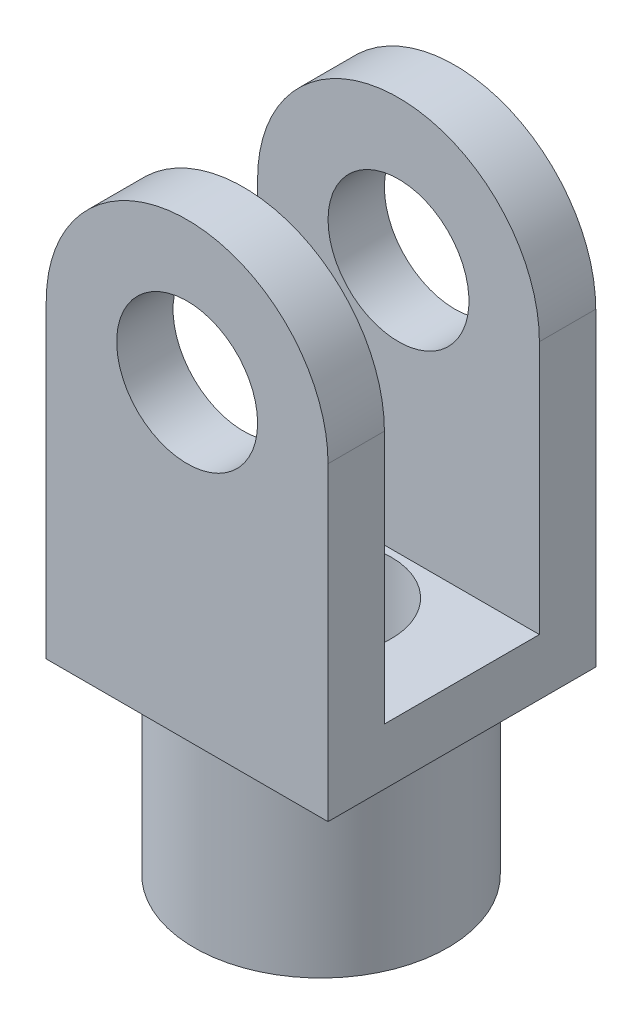
ISO-10303-21;
HEADER;
FILE_DESCRIPTION(('STEP AP214'),'2;1');
FILE_NAME('part.step','',(''),(''),'','','');
FILE_SCHEMA(('AUTOMOTIVE_DESIGN { 1 0 10303 214 1 1 1 1 }'));
ENDSEC;
DATA;
#1=APPLICATION_CONTEXT('core data for automotive mechanical design processes');
#2=APPLICATION_PROTOCOL_DEFINITION('international standard','automotive_design',2000,#1);
#3=PRODUCT_CONTEXT('',#1,'mechanical');
#4=PRODUCT('Part','Part','',(#3));
#5=PRODUCT_RELATED_PRODUCT_CATEGORY('part','',(#4));
#6=PRODUCT_DEFINITION_FORMATION('','',#4);
#7=PRODUCT_DEFINITION_CONTEXT('part definition',#1,'design');
#8=PRODUCT_DEFINITION('design','',#6,#7);
#9=PRODUCT_DEFINITION_SHAPE('','',#8);
#10=(LENGTH_UNIT() NAMED_UNIT(*) SI_UNIT(.MILLI.,.METRE.));
#11=(NAMED_UNIT(*) PLANE_ANGLE_UNIT() SI_UNIT($,.RADIAN.));
#12=(NAMED_UNIT(*) SI_UNIT($,.STERADIAN.) SOLID_ANGLE_UNIT());
#13=UNCERTAINTY_MEASURE_WITH_UNIT(LENGTH_MEASURE(1.E-05),#10,'distance_accuracy_value','');
#14=(GEOMETRIC_REPRESENTATION_CONTEXT(3) GLOBAL_UNCERTAINTY_ASSIGNED_CONTEXT((#13)) GLOBAL_UNIT_ASSIGNED_CONTEXT((#10,
#11,#12)) REPRESENTATION_CONTEXT('',''));
#15=CARTESIAN_POINT('',(0.,0.,0.));
#16=DIRECTION('',(0.,0.,1.));
#17=DIRECTION('',(1.,0.,0.));
#18=AXIS2_PLACEMENT_3D('',#15,#16,#17);
#19=CARTESIAN_POINT('',(10.,22.,19.));
#20=DIRECTION('',(0.,0.,-1.));
#21=DIRECTION('',(-1.,0.,0.));
#22=AXIS2_PLACEMENT_3D('',#19,#20,#21);
#23=CYLINDRICAL_SURFACE('',#22,10.);
#24=DIRECTION('',(0.,0.,-1.));
#25=VECTOR('',#24,1.);
#26=CARTESIAN_POINT('',(0.,22.,19.));
#27=LINE('',#26,#25);
#28=CARTESIAN_POINT('',(0.,22.,4.));
#29=VERTEX_POINT('',#28);
#30=CARTESIAN_POINT('',(0.,22.,0.));
#31=VERTEX_POINT('',#30);
#32=EDGE_CURVE('E176',#29,#31,#27,.T.);
#33=ORIENTED_EDGE('',*,*,#32,.F.);
#34=CARTESIAN_POINT('',(10.,22.,4.));
#35=DIRECTION('',(0.,0.,-1.));
#36=DIRECTION('',(-1.,0.,0.));
#37=AXIS2_PLACEMENT_3D('',#34,#35,#36);
#38=CIRCLE('',#37,10.);
#39=CARTESIAN_POINT('',(20.,22.,4.));
#40=VERTEX_POINT('',#39);
#41=EDGE_CURVE('E144',#29,#40,#38,.T.);
#42=ORIENTED_EDGE('',*,*,#41,.T.);
#43=DIRECTION('',(0.,0.,-1.));
#44=VECTOR('',#43,1.);
#45=CARTESIAN_POINT('',(20.,22.,19.));
#46=LINE('',#45,#44);
#47=CARTESIAN_POINT('',(20.,22.,0.));
#48=VERTEX_POINT('',#47);
#49=EDGE_CURVE('E136',#40,#48,#46,.T.);
#50=ORIENTED_EDGE('',*,*,#49,.T.);
#51=CARTESIAN_POINT('',(10.,22.,0.));
#52=DIRECTION('',(0.,0.,1.));
#53=DIRECTION('',(1.,0.,0.));
#54=AXIS2_PLACEMENT_3D('',#51,#52,#53);
#55=CIRCLE('',#54,10.);
#56=EDGE_CURVE('E164',#48,#31,#55,.T.);
#57=ORIENTED_EDGE('',*,*,#56,.T.);
#58=EDGE_LOOP('',(#33,#42,#50,#57));
#59=FACE_BOUND('',#58,.T.);
#60=ADVANCED_FACE('F41',(#59),#23,.T.);
#61=CARTESIAN_POINT('',(10.,22.,19.));
#62=DIRECTION('',(0.,0.,-1.));
#63=DIRECTION('',(-1.,0.,0.));
#64=AXIS2_PLACEMENT_3D('',#61,#62,#63);
#65=CYLINDRICAL_SURFACE('',#64,5.);
#66=CARTESIAN_POINT('',(10.,22.,15.));
#67=DIRECTION('',(0.,0.,1.));
#68=DIRECTION('',(1.,0.,0.));
#69=AXIS2_PLACEMENT_3D('',#66,#67,#68);
#70=CIRCLE('',#69,5.);
#71=CARTESIAN_POINT('',(15.,22.,15.));
#72=VERTEX_POINT('',#71);
#73=EDGE_CURVE('E146',#72,#72,#70,.T.);
#74=ORIENTED_EDGE('',*,*,#73,.F.);
#75=EDGE_LOOP('',(#74));
#76=FACE_BOUND('',#75,.T.);
#77=CARTESIAN_POINT('',(10.,22.,19.));
#78=DIRECTION('',(0.,0.,1.));
#79=DIRECTION('',(1.,0.,0.));
#80=AXIS2_PLACEMENT_3D('',#77,#78,#79);
#81=CIRCLE('',#80,5.);
#82=CARTESIAN_POINT('',(15.,22.,19.));
#83=VERTEX_POINT('',#82);
#84=EDGE_CURVE('E159',#83,#83,#81,.T.);
#85=ORIENTED_EDGE('',*,*,#84,.T.);
#86=EDGE_LOOP('',(#85));
#87=FACE_BOUND('',#86,.T.);
#88=ADVANCED_FACE('F188',(#76,#87),#65,.F.);
#89=CARTESIAN_POINT('',(20.,0.,19.));
#90=DIRECTION('',(-1.,0.,0.));
#91=DIRECTION('',(0.,0.,1.));
#92=AXIS2_PLACEMENT_3D('',#89,#90,#91);
#93=PLANE('',#92);
#94=DIRECTION('',(0.,0.,1.));
#95=VECTOR('',#94,1.);
#96=CARTESIAN_POINT('',(20.,4.,15.));
#97=LINE('',#96,#95);
#98=CARTESIAN_POINT('',(20.,4.,4.));
#99=VERTEX_POINT('',#98);
#100=CARTESIAN_POINT('',(20.,4.,15.));
#101=VERTEX_POINT('',#100);
#102=EDGE_CURVE('E117',#99,#101,#97,.T.);
#103=ORIENTED_EDGE('',*,*,#102,.T.);
#104=DIRECTION('',(0.,-1.,0.));
#105=VECTOR('',#104,1.);
#106=CARTESIAN_POINT('',(20.,32.,15.));
#107=LINE('',#106,#105);
#108=CARTESIAN_POINT('',(20.,22.,15.));
#109=VERTEX_POINT('',#108);
#110=EDGE_CURVE('E137',#109,#101,#107,.T.);
#111=ORIENTED_EDGE('',*,*,#110,.F.);
#112=CARTESIAN_POINT('',(20.,22.,19.));
#113=VERTEX_POINT('',#112);
#114=EDGE_CURVE('E50',#113,#109,#46,.T.);
#115=ORIENTED_EDGE('',*,*,#114,.F.);
#116=DIRECTION('',(0.,1.,0.));
#117=VECTOR('',#116,1.);
#118=CARTESIAN_POINT('',(20.,0.,19.));
#119=LINE('',#118,#117);
#120=CARTESIAN_POINT('',(20.,0.,19.));
#121=VERTEX_POINT('',#120);
#122=EDGE_CURVE('E151',#121,#113,#119,.T.);
#123=ORIENTED_EDGE('',*,*,#122,.F.);
#124=DIRECTION('',(0.,0.,-1.));
#125=VECTOR('',#124,1.);
#126=CARTESIAN_POINT('',(20.,0.,19.));
#127=LINE('',#126,#125);
#128=CARTESIAN_POINT('',(20.,0.,0.));
#129=VERTEX_POINT('',#128);
#130=EDGE_CURVE('E162',#121,#129,#127,.T.);
#131=ORIENTED_EDGE('',*,*,#130,.T.);
#132=DIRECTION('',(0.,1.,0.));
#133=VECTOR('',#132,1.);
#134=CARTESIAN_POINT('',(20.,0.,0.));
#135=LINE('',#134,#133);
#136=EDGE_CURVE('E150',#129,#48,#135,.T.);
#137=ORIENTED_EDGE('',*,*,#136,.T.);
#138=ORIENTED_EDGE('',*,*,#49,.F.);
#139=DIRECTION('',(0.,-1.,0.));
#140=VECTOR('',#139,1.);
#141=CARTESIAN_POINT('',(20.,32.,4.));
#142=LINE('',#141,#140);
#143=EDGE_CURVE('E128',#40,#99,#142,.T.);
#144=ORIENTED_EDGE('',*,*,#143,.T.);
#145=EDGE_LOOP('',(#103,#111,#115,#123,#131,#137,#138,#144));
#146=FACE_BOUND('',#145,.T.);
#147=ADVANCED_FACE('F43',(#146),#93,.F.);
#148=ORIENTED_EDGE('',*,*,#114,.T.);
#149=CARTESIAN_POINT('',(10.,22.,15.));
#150=DIRECTION('',(0.,0.,1.));
#151=DIRECTION('',(1.,0.,0.));
#152=AXIS2_PLACEMENT_3D('',#149,#150,#151);
#153=CIRCLE('',#152,10.);
#154=CARTESIAN_POINT('',(0.,22.,15.));
#155=VERTEX_POINT('',#154);
#156=EDGE_CURVE('E148',#109,#155,#153,.T.);
#157=ORIENTED_EDGE('',*,*,#156,.T.);
#158=CARTESIAN_POINT('',(0.,22.,19.));
#159=VERTEX_POINT('',#158);
#160=EDGE_CURVE('E177',#159,#155,#27,.T.);
#161=ORIENTED_EDGE('',*,*,#160,.F.);
#162=CARTESIAN_POINT('',(10.,22.,19.));
#163=DIRECTION('',(0.,0.,1.));
#164=DIRECTION('',(1.,0.,0.));
#165=AXIS2_PLACEMENT_3D('',#162,#163,#164);
#166=CIRCLE('',#165,10.);
#167=EDGE_CURVE('E96',#113,#159,#166,.T.);
#168=ORIENTED_EDGE('',*,*,#167,.F.);
#169=EDGE_LOOP('',(#148,#157,#161,#168));
#170=FACE_BOUND('',#169,.T.);
#171=ADVANCED_FACE('F210',(#170),#23,.T.);
#172=CARTESIAN_POINT('',(0.,0.,19.));
#173=DIRECTION('',(-1.,0.,0.));
#174=DIRECTION('',(0.,0.,1.));
#175=AXIS2_PLACEMENT_3D('',#172,#173,#174);
#176=PLANE('',#175);
#177=DIRECTION('',(0.,-1.,0.));
#178=VECTOR('',#177,1.);
#179=CARTESIAN_POINT('',(0.,32.,15.));
#180=LINE('',#179,#178);
#181=CARTESIAN_POINT('',(0.,4.,15.));
#182=VERTEX_POINT('',#181);
#183=EDGE_CURVE('E139',#155,#182,#180,.T.);
#184=ORIENTED_EDGE('',*,*,#183,.T.);
#185=DIRECTION('',(0.,0.,-1.));
#186=VECTOR('',#185,1.);
#187=CARTESIAN_POINT('',(0.,4.,15.));
#188=LINE('',#187,#186);
#189=CARTESIAN_POINT('',(0.,4.,4.));
#190=VERTEX_POINT('',#189);
#191=EDGE_CURVE('E133',#182,#190,#188,.T.);
#192=ORIENTED_EDGE('',*,*,#191,.T.);
#193=DIRECTION('',(0.,-1.,0.));
#194=VECTOR('',#193,1.);
#195=CARTESIAN_POINT('',(0.,32.,4.));
#196=LINE('',#195,#194);
#197=EDGE_CURVE('E131',#29,#190,#196,.T.);
#198=ORIENTED_EDGE('',*,*,#197,.F.);
#199=ORIENTED_EDGE('',*,*,#32,.T.);
#200=DIRECTION('',(0.,1.,0.));
#201=VECTOR('',#200,1.);
#202=CARTESIAN_POINT('',(0.,0.,0.));
#203=LINE('',#202,#201);
#204=CARTESIAN_POINT('',(0.,0.,0.));
#205=VERTEX_POINT('',#204);
#206=EDGE_CURVE('E167',#205,#31,#203,.T.);
#207=ORIENTED_EDGE('',*,*,#206,.F.);
#208=DIRECTION('',(0.,0.,-1.));
#209=VECTOR('',#208,1.);
#210=CARTESIAN_POINT('',(0.,0.,19.));
#211=LINE('',#210,#209);
#212=CARTESIAN_POINT('',(0.,0.,19.));
#213=VERTEX_POINT('',#212);
#214=EDGE_CURVE('E174',#213,#205,#211,.T.);
#215=ORIENTED_EDGE('',*,*,#214,.F.);
#216=DIRECTION('',(0.,1.,0.));
#217=VECTOR('',#216,1.);
#218=CARTESIAN_POINT('',(0.,0.,19.));
#219=LINE('',#218,#217);
#220=EDGE_CURVE('E155',#213,#159,#219,.T.);
#221=ORIENTED_EDGE('',*,*,#220,.T.);
#222=ORIENTED_EDGE('',*,*,#160,.T.);
#223=EDGE_LOOP('',(#184,#192,#198,#199,#207,#215,#221,#222));
#224=FACE_BOUND('',#223,.T.);
#225=ADVANCED_FACE('F216',(#224),#176,.T.);
#226=CARTESIAN_POINT('',(0.,0.,19.));
#227=DIRECTION('',(0.,1.,0.));
#228=DIRECTION('',(0.,0.,1.));
#229=AXIS2_PLACEMENT_3D('',#226,#227,#228);
#230=PLANE('',#229);
#231=CARTESIAN_POINT('',(10.,0.,9.5));
#232=DIRECTION('',(0.,-1.,0.));
#233=DIRECTION('',(0.,0.,-1.));
#234=AXIS2_PLACEMENT_3D('',#231,#232,#233);
#235=CIRCLE('',#234,9.);
#236=CARTESIAN_POINT('',(10.,0.,0.499999999999997));
#237=VERTEX_POINT('',#236);
#238=EDGE_CURVE('E11',#237,#237,#235,.T.);
#239=ORIENTED_EDGE('',*,*,#238,.F.);
#240=EDGE_LOOP('',(#239));
#241=FACE_BOUND('',#240,.T.);
#242=DIRECTION('',(1.,0.,0.));
#243=VECTOR('',#242,1.);
#244=CARTESIAN_POINT('',(0.,0.,0.));
#245=LINE('',#244,#243);
#246=EDGE_CURVE('E88',#205,#129,#245,.T.);
#247=ORIENTED_EDGE('',*,*,#246,.T.);
#248=ORIENTED_EDGE('',*,*,#130,.F.);
#249=DIRECTION('',(1.,0.,0.));
#250=VECTOR('',#249,1.);
#251=CARTESIAN_POINT('',(0.,0.,19.));
#252=LINE('',#251,#250);
#253=EDGE_CURVE('E67',#213,#121,#252,.T.);
#254=ORIENTED_EDGE('',*,*,#253,.F.);
#255=ORIENTED_EDGE('',*,*,#214,.T.);
#256=EDGE_LOOP('',(#247,#248,#254,#255));
#257=FACE_BOUND('',#256,.T.);
#258=ADVANCED_FACE('F205',(#241,#257),#230,.F.);
#259=CARTESIAN_POINT('',(10.,22.,4.));
#260=DIRECTION('',(0.,0.,-1.));
#261=DIRECTION('',(-1.,0.,0.));
#262=AXIS2_PLACEMENT_3D('',#259,#260,#261);
#263=CIRCLE('',#262,5.);
#264=CARTESIAN_POINT('',(5.,22.,4.));
#265=VERTEX_POINT('',#264);
#266=EDGE_CURVE('E147',#265,#265,#263,.T.);
#267=ORIENTED_EDGE('',*,*,#266,.F.);
#268=EDGE_LOOP('',(#267));
#269=FACE_BOUND('',#268,.T.);
#270=CARTESIAN_POINT('',(10.,22.,0.));
#271=DIRECTION('',(0.,0.,1.));
#272=DIRECTION('',(1.,0.,0.));
#273=AXIS2_PLACEMENT_3D('',#270,#271,#272);
#274=CIRCLE('',#273,5.);
#275=CARTESIAN_POINT('',(15.,22.,0.));
#276=VERTEX_POINT('',#275);
#277=EDGE_CURVE('E153',#276,#276,#274,.T.);
#278=ORIENTED_EDGE('',*,*,#277,.F.);
#279=EDGE_LOOP('',(#278));
#280=FACE_BOUND('',#279,.T.);
#281=ADVANCED_FACE('F192',(#269,#280),#65,.F.);
#282=CARTESIAN_POINT('',(0.,0.,19.));
#283=DIRECTION('',(0.,0.,1.));
#284=DIRECTION('',(1.,0.,0.));
#285=AXIS2_PLACEMENT_3D('',#282,#283,#284);
#286=PLANE('',#285);
#287=ORIENTED_EDGE('',*,*,#122,.T.);
#288=ORIENTED_EDGE('',*,*,#167,.T.);
#289=ORIENTED_EDGE('',*,*,#220,.F.);
#290=ORIENTED_EDGE('',*,*,#253,.T.);
#291=EDGE_LOOP('',(#287,#288,#289,#290));
#292=FACE_BOUND('',#291,.T.);
#293=ORIENTED_EDGE('',*,*,#84,.F.);
#294=EDGE_LOOP('',(#293));
#295=FACE_BOUND('',#294,.T.);
#296=ADVANCED_FACE('F195',(#292,#295),#286,.T.);
#297=CARTESIAN_POINT('',(0.,0.,0.));
#298=DIRECTION('',(0.,0.,1.));
#299=DIRECTION('',(1.,0.,0.));
#300=AXIS2_PLACEMENT_3D('',#297,#298,#299);
#301=PLANE('',#300);
#302=ORIENTED_EDGE('',*,*,#136,.F.);
#303=ORIENTED_EDGE('',*,*,#246,.F.);
#304=ORIENTED_EDGE('',*,*,#206,.T.);
#305=ORIENTED_EDGE('',*,*,#56,.F.);
#306=EDGE_LOOP('',(#302,#303,#304,#305));
#307=FACE_BOUND('',#306,.T.);
#308=ORIENTED_EDGE('',*,*,#277,.T.);
#309=EDGE_LOOP('',(#308));
#310=FACE_BOUND('',#309,.T.);
#311=ADVANCED_FACE('F197',(#307,#310),#301,.F.);
#312=CARTESIAN_POINT('',(0.,32.,15.));
#313=DIRECTION('',(0.,0.,1.));
#314=DIRECTION('',(1.,0.,0.));
#315=AXIS2_PLACEMENT_3D('',#312,#313,#314);
#316=PLANE('',#315);
#317=ORIENTED_EDGE('',*,*,#73,.T.);
#318=EDGE_LOOP('',(#317));
#319=FACE_BOUND('',#318,.T.);
#320=ORIENTED_EDGE('',*,*,#110,.T.);
#321=DIRECTION('',(-1.,0.,0.));
#322=VECTOR('',#321,1.);
#323=CARTESIAN_POINT('',(0.,4.,15.));
#324=LINE('',#323,#322);
#325=EDGE_CURVE('E120',#101,#182,#324,.T.);
#326=ORIENTED_EDGE('',*,*,#325,.T.);
#327=ORIENTED_EDGE('',*,*,#183,.F.);
#328=ORIENTED_EDGE('',*,*,#156,.F.);
#329=EDGE_LOOP('',(#320,#326,#327,#328));
#330=FACE_BOUND('',#329,.T.);
#331=ADVANCED_FACE('F185',(#319,#330),#316,.F.);
#332=CARTESIAN_POINT('',(0.,32.,4.));
#333=DIRECTION('',(0.,0.,-1.));
#334=DIRECTION('',(-1.,0.,0.));
#335=AXIS2_PLACEMENT_3D('',#332,#333,#334);
#336=PLANE('',#335);
#337=ORIENTED_EDGE('',*,*,#266,.T.);
#338=EDGE_LOOP('',(#337));
#339=FACE_BOUND('',#338,.T.);
#340=ORIENTED_EDGE('',*,*,#197,.T.);
#341=DIRECTION('',(1.,0.,0.));
#342=VECTOR('',#341,1.);
#343=CARTESIAN_POINT('',(0.,4.,4.));
#344=LINE('',#343,#342);
#345=EDGE_CURVE('E58',#190,#99,#344,.T.);
#346=ORIENTED_EDGE('',*,*,#345,.T.);
#347=ORIENTED_EDGE('',*,*,#143,.F.);
#348=ORIENTED_EDGE('',*,*,#41,.F.);
#349=EDGE_LOOP('',(#340,#346,#347,#348));
#350=FACE_BOUND('',#349,.T.);
#351=ADVANCED_FACE('F127',(#339,#350),#336,.F.);
#352=CARTESIAN_POINT('',(0.,4.,0.));
#353=DIRECTION('',(0.,-1.,0.));
#354=DIRECTION('',(0.,0.,-1.));
#355=AXIS2_PLACEMENT_3D('',#352,#353,#354);
#356=PLANE('',#355);
#357=CARTESIAN_POINT('',(10.,4.,9.5));
#358=DIRECTION('',(0.,-1.,0.));
#359=DIRECTION('',(0.,0.,-1.));
#360=AXIS2_PLACEMENT_3D('',#357,#358,#359);
#361=CIRCLE('',#360,5.);
#362=CARTESIAN_POINT('',(10.,4.,4.5));
#363=VERTEX_POINT('',#362);
#364=EDGE_CURVE('E45',#363,#363,#361,.T.);
#365=ORIENTED_EDGE('',*,*,#364,.T.);
#366=EDGE_LOOP('',(#365));
#367=FACE_BOUND('',#366,.T.);
#368=ORIENTED_EDGE('',*,*,#191,.F.);
#369=ORIENTED_EDGE('',*,*,#325,.F.);
#370=ORIENTED_EDGE('',*,*,#102,.F.);
#371=ORIENTED_EDGE('',*,*,#345,.F.);
#372=EDGE_LOOP('',(#368,#369,#370,#371));
#373=FACE_BOUND('',#372,.T.);
#374=ADVANCED_FACE('F118',(#367,#373),#356,.F.);
#375=CARTESIAN_POINT('',(10.,32.,9.5));
#376=DIRECTION('',(0.,-1.,0.));
#377=DIRECTION('',(0.,0.,-1.));
#378=AXIS2_PLACEMENT_3D('',#375,#376,#377);
#379=CYLINDRICAL_SURFACE('',#378,5.);
#380=ORIENTED_EDGE('',*,*,#364,.F.);
#381=EDGE_LOOP('',(#380));
#382=FACE_BOUND('',#381,.T.);
#383=CARTESIAN_POINT('',(10.,-13.,9.5));
#384=DIRECTION('',(0.,-1.,0.));
#385=DIRECTION('',(0.,0.,-1.));
#386=AXIS2_PLACEMENT_3D('',#383,#384,#385);
#387=CIRCLE('',#386,5.);
#388=CARTESIAN_POINT('',(10.,-13.,4.5));
#389=VERTEX_POINT('',#388);
#390=EDGE_CURVE('E237',#389,#389,#387,.T.);
#391=ORIENTED_EDGE('',*,*,#390,.T.);
#392=EDGE_LOOP('',(#391));
#393=FACE_BOUND('',#392,.T.);
#394=ADVANCED_FACE('F241',(#382,#393),#379,.F.);
#395=CARTESIAN_POINT('',(10.,-13.,9.5));
#396=DIRECTION('',(0.,-1.,0.));
#397=DIRECTION('',(0.,0.,-1.));
#398=AXIS2_PLACEMENT_3D('',#395,#396,#397);
#399=PLANE('',#398);
#400=CARTESIAN_POINT('',(10.,-13.,9.5));
#401=DIRECTION('',(0.,-1.,0.));
#402=DIRECTION('',(0.,0.,-1.));
#403=AXIS2_PLACEMENT_3D('',#400,#401,#402);
#404=CIRCLE('',#403,9.);
#405=CARTESIAN_POINT('',(10.,-13.,0.499999999999997));
#406=VERTEX_POINT('',#405);
#407=EDGE_CURVE('E232',#406,#406,#404,.T.);
#408=ORIENTED_EDGE('',*,*,#407,.T.);
#409=EDGE_LOOP('',(#408));
#410=FACE_BOUND('',#409,.T.);
#411=ORIENTED_EDGE('',*,*,#390,.F.);
#412=EDGE_LOOP('',(#411));
#413=FACE_BOUND('',#412,.T.);
#414=ADVANCED_FACE('F243',(#410,#413),#399,.T.);
#415=CARTESIAN_POINT('',(10.,-13.,9.5));
#416=DIRECTION('',(0.,1.,0.));
#417=DIRECTION('',(0.,0.,1.));
#418=AXIS2_PLACEMENT_3D('',#415,#416,#417);
#419=CYLINDRICAL_SURFACE('',#418,9.);
#420=ORIENTED_EDGE('',*,*,#407,.F.);
#421=EDGE_LOOP('',(#420));
#422=FACE_BOUND('',#421,.T.);
#423=ORIENTED_EDGE('',*,*,#238,.T.);
#424=EDGE_LOOP('',(#423));
#425=FACE_BOUND('',#424,.T.);
#426=ADVANCED_FACE('F245',(#422,#425),#419,.T.);
#427=CLOSED_SHELL('',(#60,#88,#147,#171,#225,#258,#281,#296,#311,#331,#351,#374,#394,#414,#426));
#428=MANIFOLD_SOLID_BREP('B2',#427);
#429=ADVANCED_BREP_SHAPE_REPRESENTATION('',(#18,#428),#14);
#430=SHAPE_DEFINITION_REPRESENTATION(#9,#429);
ENDSEC;
END-ISO-10303-21;
